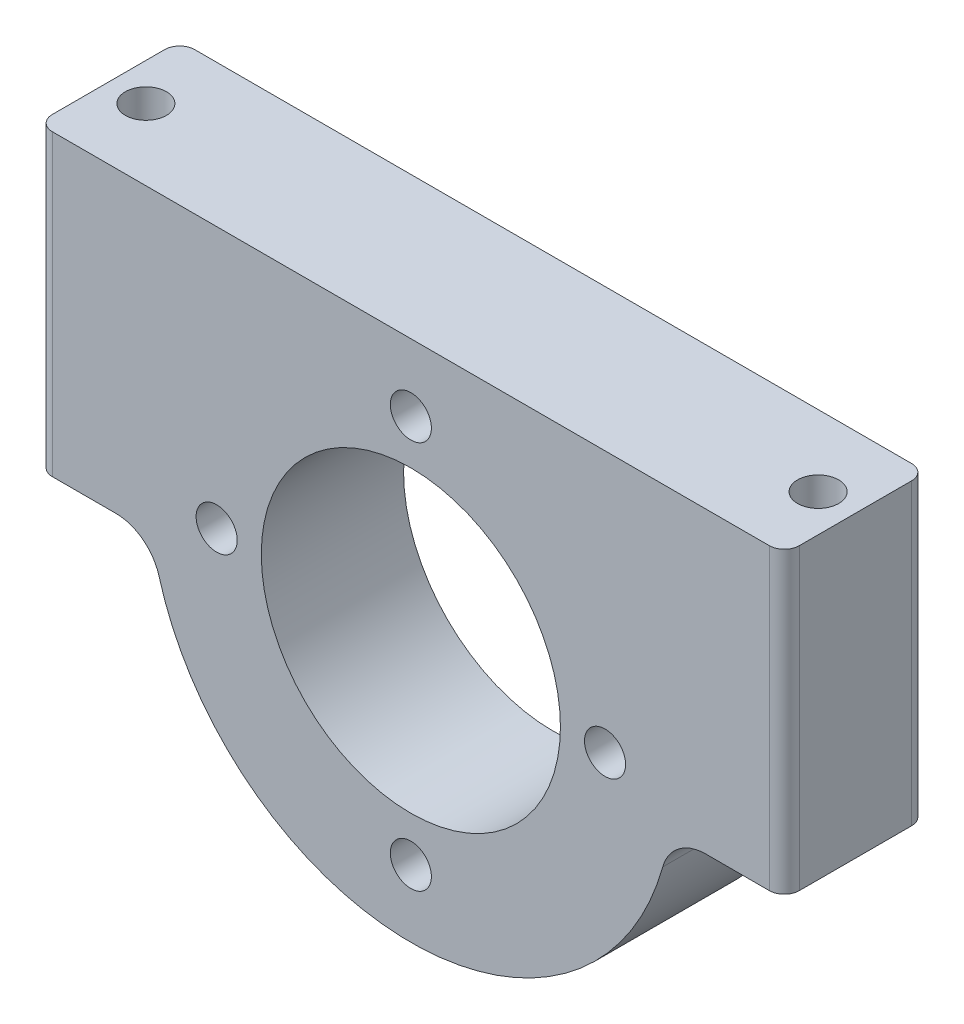
ISO-10303-21;
HEADER;
FILE_DESCRIPTION(('STEP AP214'),'2;1');
FILE_NAME('part.step','',(''),(''),'','','');
FILE_SCHEMA(('AUTOMOTIVE_DESIGN { 1 0 10303 214 1 1 1 1 }'));
ENDSEC;
DATA;
#1=APPLICATION_CONTEXT('core data for automotive mechanical design processes');
#2=APPLICATION_PROTOCOL_DEFINITION('international standard','automotive_design',2000,#1);
#3=PRODUCT_CONTEXT('',#1,'mechanical');
#4=PRODUCT('Part','Part','',(#3));
#5=PRODUCT_RELATED_PRODUCT_CATEGORY('part','',(#4));
#6=PRODUCT_DEFINITION_FORMATION('','',#4);
#7=PRODUCT_DEFINITION_CONTEXT('part definition',#1,'design');
#8=PRODUCT_DEFINITION('design','',#6,#7);
#9=PRODUCT_DEFINITION_SHAPE('','',#8);
#10=(LENGTH_UNIT() NAMED_UNIT(*) SI_UNIT(.MILLI.,.METRE.));
#11=(NAMED_UNIT(*) PLANE_ANGLE_UNIT() SI_UNIT($,.RADIAN.));
#12=(NAMED_UNIT(*) SI_UNIT($,.STERADIAN.) SOLID_ANGLE_UNIT());
#13=UNCERTAINTY_MEASURE_WITH_UNIT(LENGTH_MEASURE(1.E-05),#10,'distance_accuracy_value','');
#14=(GEOMETRIC_REPRESENTATION_CONTEXT(3) GLOBAL_UNCERTAINTY_ASSIGNED_CONTEXT((#13)) GLOBAL_UNIT_ASSIGNED_CONTEXT((#10,
#11,#12)) REPRESENTATION_CONTEXT('',''));
#15=CARTESIAN_POINT('',(0.,0.,0.));
#16=DIRECTION('',(0.,0.,1.));
#17=DIRECTION('',(1.,0.,0.));
#18=AXIS2_PLACEMENT_3D('',#15,#16,#17);
#19=CARTESIAN_POINT('',(463.810652388512,-202.071051768843,-19.05));
#20=DIRECTION('',(0.,0.,-1.));
#21=DIRECTION('',(-1.,0.,0.));
#22=AXIS2_PLACEMENT_3D('',#19,#20,#21);
#23=CYLINDRICAL_SURFACE('',#22,4.875);
#24=CARTESIAN_POINT('',(463.810652388512,-202.071051768843,-19.05));
#25=DIRECTION('',(0.,0.,-1.));
#26=DIRECTION('',(-1.,0.,0.));
#27=AXIS2_PLACEMENT_3D('',#24,#25,#26);
#28=CIRCLE('',#27,4.875);
#29=CARTESIAN_POINT('',(458.935652388512,-202.071051768843,-19.05));
#30=VERTEX_POINT('',#29);
#31=EDGE_CURVE('E147',#30,#30,#28,.F.);
#32=ORIENTED_EDGE('',*,*,#31,.F.);
#33=EDGE_LOOP('',(#32));
#34=FACE_BOUND('',#33,.T.);
#35=CARTESIAN_POINT('',(463.810652388512,-202.071051768843,-14.05));
#36=DIRECTION('',(0.,0.,-1.));
#37=DIRECTION('',(-1.,0.,0.));
#38=AXIS2_PLACEMENT_3D('',#35,#36,#37);
#39=CIRCLE('',#38,4.875);
#40=CARTESIAN_POINT('',(458.935652388512,-202.071051768843,-14.05));
#41=VERTEX_POINT('',#40);
#42=EDGE_CURVE('E239',#41,#41,#39,.T.);
#43=ORIENTED_EDGE('',*,*,#42,.F.);
#44=EDGE_LOOP('',(#43));
#45=FACE_BOUND('',#44,.T.);
#46=ADVANCED_FACE('F17',(#34,#45),#23,.F.);
#47=CARTESIAN_POINT('',(463.810652388512,-254.071051768843,-19.05));
#48=DIRECTION('',(0.,0.,-1.));
#49=DIRECTION('',(-1.,0.,0.));
#50=AXIS2_PLACEMENT_3D('',#47,#48,#49);
#51=CYLINDRICAL_SURFACE('',#50,4.875);
#52=CARTESIAN_POINT('',(463.810652388512,-254.071051768843,-19.05));
#53=DIRECTION('',(0.,0.,-1.));
#54=DIRECTION('',(-1.,0.,0.));
#55=AXIS2_PLACEMENT_3D('',#52,#53,#54);
#56=CIRCLE('',#55,4.875);
#57=CARTESIAN_POINT('',(458.935652388512,-254.071051768843,-19.05));
#58=VERTEX_POINT('',#57);
#59=EDGE_CURVE('E230',#58,#58,#56,.F.);
#60=ORIENTED_EDGE('',*,*,#59,.F.);
#61=EDGE_LOOP('',(#60));
#62=FACE_BOUND('',#61,.T.);
#63=CARTESIAN_POINT('',(463.810652388512,-254.071051768843,-14.05));
#64=DIRECTION('',(0.,0.,-1.));
#65=DIRECTION('',(-1.,0.,0.));
#66=AXIS2_PLACEMENT_3D('',#63,#64,#65);
#67=CIRCLE('',#66,4.875);
#68=CARTESIAN_POINT('',(458.935652388512,-254.071051768843,-14.05));
#69=VERTEX_POINT('',#68);
#70=EDGE_CURVE('E20',#69,#69,#67,.T.);
#71=ORIENTED_EDGE('',*,*,#70,.F.);
#72=EDGE_LOOP('',(#71));
#73=FACE_BOUND('',#72,.T.);
#74=ADVANCED_FACE('F248',(#62,#73),#51,.F.);
#75=CARTESIAN_POINT('',(489.810652388512,-228.071051768843,-19.05));
#76=DIRECTION('',(0.,0.,-1.));
#77=DIRECTION('',(-1.,0.,0.));
#78=AXIS2_PLACEMENT_3D('',#75,#76,#77);
#79=CYLINDRICAL_SURFACE('',#78,4.875);
#80=CARTESIAN_POINT('',(489.810652388512,-228.071051768843,-19.05));
#81=DIRECTION('',(0.,0.,-1.));
#82=DIRECTION('',(-1.,0.,0.));
#83=AXIS2_PLACEMENT_3D('',#80,#81,#82);
#84=CIRCLE('',#83,4.875);
#85=CARTESIAN_POINT('',(484.935652388512,-228.071051768843,-19.05));
#86=VERTEX_POINT('',#85);
#87=EDGE_CURVE('E227',#86,#86,#84,.F.);
#88=ORIENTED_EDGE('',*,*,#87,.F.);
#89=EDGE_LOOP('',(#88));
#90=FACE_BOUND('',#89,.T.);
#91=CARTESIAN_POINT('',(489.810652388512,-228.071051768843,-14.05));
#92=DIRECTION('',(0.,0.,-1.));
#93=DIRECTION('',(-1.,0.,0.));
#94=AXIS2_PLACEMENT_3D('',#91,#92,#93);
#95=CIRCLE('',#94,4.875);
#96=CARTESIAN_POINT('',(484.935652388512,-228.071051768843,-14.05));
#97=VERTEX_POINT('',#96);
#98=EDGE_CURVE('E148',#97,#97,#95,.T.);
#99=ORIENTED_EDGE('',*,*,#98,.F.);
#100=EDGE_LOOP('',(#99));
#101=FACE_BOUND('',#100,.T.);
#102=ADVANCED_FACE('F250',(#90,#101),#79,.F.);
#103=CARTESIAN_POINT('',(437.810652388512,-228.071051768843,-19.05));
#104=DIRECTION('',(0.,0.,-1.));
#105=DIRECTION('',(-1.,0.,0.));
#106=AXIS2_PLACEMENT_3D('',#103,#104,#105);
#107=CYLINDRICAL_SURFACE('',#106,4.875);
#108=CARTESIAN_POINT('',(437.810652388512,-228.071051768843,-19.05));
#109=DIRECTION('',(0.,0.,-1.));
#110=DIRECTION('',(-1.,0.,0.));
#111=AXIS2_PLACEMENT_3D('',#108,#109,#110);
#112=CIRCLE('',#111,4.875);
#113=CARTESIAN_POINT('',(432.935652388512,-228.071051768843,-19.05));
#114=VERTEX_POINT('',#113);
#115=EDGE_CURVE('E122',#114,#114,#112,.F.);
#116=ORIENTED_EDGE('',*,*,#115,.F.);
#117=EDGE_LOOP('',(#116));
#118=FACE_BOUND('',#117,.T.);
#119=CARTESIAN_POINT('',(437.810652388512,-228.071051768843,-14.05));
#120=DIRECTION('',(0.,0.,-1.));
#121=DIRECTION('',(-1.,0.,0.));
#122=AXIS2_PLACEMENT_3D('',#119,#120,#121);
#123=CIRCLE('',#122,4.875);
#124=CARTESIAN_POINT('',(432.935652388512,-228.071051768843,-14.05));
#125=VERTEX_POINT('',#124);
#126=EDGE_CURVE('E237',#125,#125,#123,.T.);
#127=ORIENTED_EDGE('',*,*,#126,.F.);
#128=EDGE_LOOP('',(#127));
#129=FACE_BOUND('',#128,.T.);
#130=ADVANCED_FACE('F257',(#118,#129),#107,.F.);
#131=CARTESIAN_POINT('',(463.810652388512,-195.508551768842,-14.05));
#132=DIRECTION('',(0.,0.,-1.));
#133=DIRECTION('',(-1.,0.,0.));
#134=AXIS2_PLACEMENT_3D('',#131,#132,#133);
#135=PLANE('',#134);
#136=CARTESIAN_POINT('',(463.810652388512,-254.071051768843,-14.05));
#137=DIRECTION('',(0.,0.,-1.));
#138=DIRECTION('',(-1.,0.,0.));
#139=AXIS2_PLACEMENT_3D('',#136,#137,#138);
#140=CIRCLE('',#139,2.75);
#141=CARTESIAN_POINT('',(461.060652388512,-254.071051768843,-14.05));
#142=VERTEX_POINT('',#141);
#143=EDGE_CURVE('E143',#142,#142,#140,.F.);
#144=ORIENTED_EDGE('',*,*,#143,.T.);
#145=EDGE_LOOP('',(#144));
#146=FACE_BOUND('',#145,.T.);
#147=ORIENTED_EDGE('',*,*,#70,.T.);
#148=EDGE_LOOP('',(#147));
#149=FACE_BOUND('',#148,.T.);
#150=ADVANCED_FACE('F246',(#146,#149),#135,.T.);
#151=CARTESIAN_POINT('',(463.810652388512,-195.508551768842,-14.05));
#152=DIRECTION('',(0.,0.,-1.));
#153=DIRECTION('',(-1.,0.,0.));
#154=AXIS2_PLACEMENT_3D('',#151,#152,#153);
#155=PLANE('',#154);
#156=CARTESIAN_POINT('',(463.810652388512,-202.071051768843,-14.05));
#157=DIRECTION('',(0.,0.,-1.));
#158=DIRECTION('',(-1.,0.,0.));
#159=AXIS2_PLACEMENT_3D('',#156,#157,#158);
#160=CIRCLE('',#159,2.75);
#161=CARTESIAN_POINT('',(461.060652388512,-202.071051768843,-14.05));
#162=VERTEX_POINT('',#161);
#163=EDGE_CURVE('E220',#162,#162,#160,.F.);
#164=ORIENTED_EDGE('',*,*,#163,.T.);
#165=EDGE_LOOP('',(#164));
#166=FACE_BOUND('',#165,.T.);
#167=ORIENTED_EDGE('',*,*,#42,.T.);
#168=EDGE_LOOP('',(#167));
#169=FACE_BOUND('',#168,.T.);
#170=ADVANCED_FACE('F350',(#166,#169),#155,.T.);
#171=CARTESIAN_POINT('',(463.810652388512,-195.508551768842,-14.05));
#172=DIRECTION('',(0.,0.,-1.));
#173=DIRECTION('',(-1.,0.,0.));
#174=AXIS2_PLACEMENT_3D('',#171,#172,#173);
#175=PLANE('',#174);
#176=CARTESIAN_POINT('',(437.810652388512,-228.071051768843,-14.05));
#177=DIRECTION('',(0.,0.,-1.));
#178=DIRECTION('',(-1.,0.,0.));
#179=AXIS2_PLACEMENT_3D('',#176,#177,#178);
#180=CIRCLE('',#179,2.75);
#181=CARTESIAN_POINT('',(435.060652388512,-228.071051768843,-14.05));
#182=VERTEX_POINT('',#181);
#183=EDGE_CURVE('E214',#182,#182,#180,.F.);
#184=ORIENTED_EDGE('',*,*,#183,.T.);
#185=EDGE_LOOP('',(#184));
#186=FACE_BOUND('',#185,.T.);
#187=ORIENTED_EDGE('',*,*,#126,.T.);
#188=EDGE_LOOP('',(#187));
#189=FACE_BOUND('',#188,.T.);
#190=ADVANCED_FACE('F346',(#186,#189),#175,.T.);
#191=CARTESIAN_POINT('',(463.810652388512,-195.508551768842,-14.05));
#192=DIRECTION('',(0.,0.,-1.));
#193=DIRECTION('',(-1.,0.,0.));
#194=AXIS2_PLACEMENT_3D('',#191,#192,#193);
#195=PLANE('',#194);
#196=CARTESIAN_POINT('',(489.810652388512,-228.071051768843,-14.05));
#197=DIRECTION('',(0.,0.,-1.));
#198=DIRECTION('',(-1.,0.,0.));
#199=AXIS2_PLACEMENT_3D('',#196,#197,#198);
#200=CIRCLE('',#199,2.75);
#201=CARTESIAN_POINT('',(487.060652388512,-228.071051768843,-14.05));
#202=VERTEX_POINT('',#201);
#203=EDGE_CURVE('E211',#202,#202,#200,.F.);
#204=ORIENTED_EDGE('',*,*,#203,.T.);
#205=EDGE_LOOP('',(#204));
#206=FACE_BOUND('',#205,.T.);
#207=ORIENTED_EDGE('',*,*,#98,.T.);
#208=EDGE_LOOP('',(#207));
#209=FACE_BOUND('',#208,.T.);
#210=ADVANCED_FACE('F342',(#206,#209),#195,.T.);
#211=CARTESIAN_POINT('',(508.810652388512,-186.071049368843,-9.52500000000001));
#212=DIRECTION('',(0.,-1.,0.));
#213=DIRECTION('',(0.,0.,-1.));
#214=AXIS2_PLACEMENT_3D('',#211,#212,#213);
#215=CYLINDRICAL_SURFACE('',#214,2.75);
#216=CARTESIAN_POINT('',(508.810652388512,-233.071051768843,-9.52500000000001));
#217=DIRECTION('',(0.,-1.,0.));
#218=DIRECTION('',(0.,0.,-1.));
#219=AXIS2_PLACEMENT_3D('',#216,#217,#218);
#220=CIRCLE('',#219,2.75);
#221=CARTESIAN_POINT('',(508.810652388512,-233.071051768843,-12.275));
#222=VERTEX_POINT('',#221);
#223=EDGE_CURVE('E202',#222,#222,#220,.F.);
#224=ORIENTED_EDGE('',*,*,#223,.F.);
#225=EDGE_LOOP('',(#224));
#226=FACE_BOUND('',#225,.T.);
#227=CARTESIAN_POINT('',(508.810652388512,-193.071051768843,-9.52500000000001));
#228=DIRECTION('',(0.,-1.,0.));
#229=DIRECTION('',(0.,0.,-1.));
#230=AXIS2_PLACEMENT_3D('',#227,#228,#229);
#231=CIRCLE('',#230,2.75);
#232=CARTESIAN_POINT('',(508.810652388512,-193.071051768843,-12.275));
#233=VERTEX_POINT('',#232);
#234=EDGE_CURVE('E208',#233,#233,#231,.T.);
#235=ORIENTED_EDGE('',*,*,#234,.F.);
#236=EDGE_LOOP('',(#235));
#237=FACE_BOUND('',#236,.T.);
#238=ADVANCED_FACE('F339',(#226,#237),#215,.F.);
#239=CARTESIAN_POINT('',(511.810652388512,0.78094512195122,-17.05));
#240=DIRECTION('',(0.,-1.,0.));
#241=DIRECTION('',(0.,0.,-1.));
#242=AXIS2_PLACEMENT_3D('',#239,#240,#241);
#243=CYLINDRICAL_SURFACE('',#242,2.);
#244=DIRECTION('',(0.,1.,0.));
#245=VECTOR('',#244,1.);
#246=CARTESIAN_POINT('',(513.810652388512,-263.071051768843,-17.05));
#247=LINE('',#246,#245);
#248=CARTESIAN_POINT('',(513.810652388512,-233.071051768843,-17.05));
#249=VERTEX_POINT('',#248);
#250=CARTESIAN_POINT('',(513.810652388512,-193.071051768843,-17.05));
#251=VERTEX_POINT('',#250);
#252=EDGE_CURVE('E97',#249,#251,#247,.T.);
#253=ORIENTED_EDGE('',*,*,#252,.F.);
#254=CARTESIAN_POINT('',(511.810652388512,-233.071051768843,-17.05));
#255=DIRECTION('',(0.,-1.,0.));
#256=DIRECTION('',(0.,0.,-1.));
#257=AXIS2_PLACEMENT_3D('',#254,#255,#256);
#258=CIRCLE('',#257,2.);
#259=CARTESIAN_POINT('',(511.810652388512,-233.071051768843,-19.05));
#260=VERTEX_POINT('',#259);
#261=EDGE_CURVE('E117',#260,#249,#258,.T.);
#262=ORIENTED_EDGE('',*,*,#261,.F.);
#263=DIRECTION('',(0.,1.,0.));
#264=VECTOR('',#263,1.);
#265=CARTESIAN_POINT('',(511.810652388512,0.78094512195122,-19.05));
#266=LINE('',#265,#264);
#267=CARTESIAN_POINT('',(511.810652388512,-193.071051768843,-19.05));
#268=VERTEX_POINT('',#267);
#269=EDGE_CURVE('E115',#268,#260,#266,.F.);
#270=ORIENTED_EDGE('',*,*,#269,.F.);
#271=CARTESIAN_POINT('',(511.810652388512,-193.071051768843,-17.05));
#272=DIRECTION('',(0.,-1.,0.));
#273=DIRECTION('',(0.,0.,-1.));
#274=AXIS2_PLACEMENT_3D('',#271,#272,#273);
#275=CIRCLE('',#274,2.);
#276=EDGE_CURVE('E103',#251,#268,#275,.F.);
#277=ORIENTED_EDGE('',*,*,#276,.F.);
#278=EDGE_LOOP('',(#253,#262,#270,#277));
#279=FACE_BOUND('',#278,.T.);
#280=ADVANCED_FACE('F116',(#279),#243,.T.);
#281=CARTESIAN_POINT('',(513.810652388512,-263.071051768843,0.));
#282=DIRECTION('',(1.,0.,0.));
#283=DIRECTION('',(0.,0.,-1.));
#284=AXIS2_PLACEMENT_3D('',#281,#282,#283);
#285=PLANE('',#284);
#286=ORIENTED_EDGE('',*,*,#252,.T.);
#287=DIRECTION('',(0.,0.,1.));
#288=VECTOR('',#287,1.);
#289=CARTESIAN_POINT('',(513.810652388512,-193.071051768843,0.));
#290=LINE('',#289,#288);
#291=CARTESIAN_POINT('',(513.810652388512,-193.071051768843,-2.));
#292=VERTEX_POINT('',#291);
#293=EDGE_CURVE('E111',#292,#251,#290,.F.);
#294=ORIENTED_EDGE('',*,*,#293,.F.);
#295=DIRECTION('',(0.,-1.,0.));
#296=VECTOR('',#295,1.);
#297=CARTESIAN_POINT('',(513.810652388512,0.78094512195122,-2.));
#298=LINE('',#297,#296);
#299=CARTESIAN_POINT('',(513.810652388512,-233.071051768843,-2.));
#300=VERTEX_POINT('',#299);
#301=EDGE_CURVE('E144',#300,#292,#298,.F.);
#302=ORIENTED_EDGE('',*,*,#301,.F.);
#303=DIRECTION('',(0.,0.,-1.));
#304=VECTOR('',#303,1.);
#305=CARTESIAN_POINT('',(513.810652388512,-233.071051768843,-9.52499999999998));
#306=LINE('',#305,#304);
#307=EDGE_CURVE('E199',#249,#300,#306,.F.);
#308=ORIENTED_EDGE('',*,*,#307,.F.);
#309=EDGE_LOOP('',(#286,#294,#302,#308));
#310=FACE_BOUND('',#309,.T.);
#311=ADVANCED_FACE('F333',(#310),#285,.T.);
#312=CARTESIAN_POINT('',(418.810652388512,-186.071049368843,-9.52500000000001));
#313=DIRECTION('',(0.,-1.,0.));
#314=DIRECTION('',(0.,0.,-1.));
#315=AXIS2_PLACEMENT_3D('',#312,#313,#314);
#316=CYLINDRICAL_SURFACE('',#315,2.75);
#317=CARTESIAN_POINT('',(418.810652388512,-233.071051768843,-9.52500000000001));
#318=DIRECTION('',(0.,-1.,0.));
#319=DIRECTION('',(0.,0.,-1.));
#320=AXIS2_PLACEMENT_3D('',#317,#318,#319);
#321=CIRCLE('',#320,2.75);
#322=CARTESIAN_POINT('',(418.810652388512,-233.071051768843,-12.275));
#323=VERTEX_POINT('',#322);
#324=EDGE_CURVE('E183',#323,#323,#321,.F.);
#325=ORIENTED_EDGE('',*,*,#324,.F.);
#326=EDGE_LOOP('',(#325));
#327=FACE_BOUND('',#326,.T.);
#328=CARTESIAN_POINT('',(418.810652388512,-193.071051768843,-9.52500000000001));
#329=DIRECTION('',(0.,-1.,0.));
#330=DIRECTION('',(0.,0.,-1.));
#331=AXIS2_PLACEMENT_3D('',#328,#329,#330);
#332=CIRCLE('',#331,2.75);
#333=CARTESIAN_POINT('',(418.810652388512,-193.071051768843,-12.275));
#334=VERTEX_POINT('',#333);
#335=EDGE_CURVE('E136',#334,#334,#332,.T.);
#336=ORIENTED_EDGE('',*,*,#335,.F.);
#337=EDGE_LOOP('',(#336));
#338=FACE_BOUND('',#337,.T.);
#339=ADVANCED_FACE('F329',(#327,#338),#316,.F.);
#340=CARTESIAN_POINT('',(415.810652388512,0.78094512195122,-17.05));
#341=DIRECTION('',(0.,1.,0.));
#342=DIRECTION('',(0.,0.,1.));
#343=AXIS2_PLACEMENT_3D('',#340,#341,#342);
#344=CYLINDRICAL_SURFACE('',#343,2.);
#345=DIRECTION('',(0.,1.,0.));
#346=VECTOR('',#345,1.);
#347=CARTESIAN_POINT('',(413.810652388512,-193.071051768843,-17.05));
#348=LINE('',#347,#346);
#349=CARTESIAN_POINT('',(413.810652388512,-193.071051768843,-17.05));
#350=VERTEX_POINT('',#349);
#351=CARTESIAN_POINT('',(413.810652388512,-233.071051768843,-17.05));
#352=VERTEX_POINT('',#351);
#353=EDGE_CURVE('E141',#350,#352,#348,.F.);
#354=ORIENTED_EDGE('',*,*,#353,.F.);
#355=CARTESIAN_POINT('',(415.810652388512,-193.071051768843,-17.05));
#356=DIRECTION('',(0.,1.,0.));
#357=DIRECTION('',(0.,0.,1.));
#358=AXIS2_PLACEMENT_3D('',#355,#356,#357);
#359=CIRCLE('',#358,2.);
#360=CARTESIAN_POINT('',(415.810652388512,-193.071051768843,-19.05));
#361=VERTEX_POINT('',#360);
#362=EDGE_CURVE('E128',#361,#350,#359,.T.);
#363=ORIENTED_EDGE('',*,*,#362,.F.);
#364=DIRECTION('',(0.,1.,0.));
#365=VECTOR('',#364,1.);
#366=CARTESIAN_POINT('',(415.810652388512,0.78094512195122,-19.05));
#367=LINE('',#366,#365);
#368=CARTESIAN_POINT('',(415.810652388512,-233.071051768843,-19.05));
#369=VERTEX_POINT('',#368);
#370=EDGE_CURVE('E121',#369,#361,#367,.T.);
#371=ORIENTED_EDGE('',*,*,#370,.F.);
#372=CARTESIAN_POINT('',(415.810652388512,-233.071051768843,-17.05));
#373=DIRECTION('',(0.,1.,0.));
#374=DIRECTION('',(0.,0.,1.));
#375=AXIS2_PLACEMENT_3D('',#372,#373,#374);
#376=CIRCLE('',#375,2.);
#377=EDGE_CURVE('E180',#352,#369,#376,.F.);
#378=ORIENTED_EDGE('',*,*,#377,.F.);
#379=EDGE_LOOP('',(#354,#363,#371,#378));
#380=FACE_BOUND('',#379,.T.);
#381=ADVANCED_FACE('F326',(#380),#344,.T.);
#382=CARTESIAN_POINT('',(5.,0.78094512195122,-19.05));
#383=DIRECTION('',(0.,0.,-1.));
#384=DIRECTION('',(-1.,0.,0.));
#385=AXIS2_PLACEMENT_3D('',#382,#383,#384);
#386=PLANE('',#385);
#387=ORIENTED_EDGE('',*,*,#370,.T.);
#388=DIRECTION('',(1.,0.,0.));
#389=VECTOR('',#388,1.);
#390=CARTESIAN_POINT('',(513.810652388512,-193.071051768843,-19.05));
#391=LINE('',#390,#389);
#392=EDGE_CURVE('E108',#268,#361,#391,.F.);
#393=ORIENTED_EDGE('',*,*,#392,.F.);
#394=ORIENTED_EDGE('',*,*,#269,.T.);
#395=DIRECTION('',(1.,0.,0.));
#396=VECTOR('',#395,1.);
#397=CARTESIAN_POINT('',(463.810652388512,-233.071051768843,-19.05));
#398=LINE('',#397,#396);
#399=CARTESIAN_POINT('',(503.307487704775,-233.071051768843,-19.05));
#400=VERTEX_POINT('',#399);
#401=EDGE_CURVE('E201',#400,#260,#398,.T.);
#402=ORIENTED_EDGE('',*,*,#401,.F.);
#403=CARTESIAN_POINT('',(503.307487704775,-239.071051768843,-19.05));
#404=DIRECTION('',(0.,0.,-1.));
#405=DIRECTION('',(-1.,0.,0.));
#406=AXIS2_PLACEMENT_3D('',#403,#404,#405);
#407=CIRCLE('',#406,6.);
#408=CARTESIAN_POINT('',(497.527463024346,-237.461295671282,-19.05));
#409=VERTEX_POINT('',#408);
#410=EDGE_CURVE('E194',#400,#409,#407,.F.);
#411=ORIENTED_EDGE('',*,*,#410,.T.);
#412=CARTESIAN_POINT('',(463.810652388512,-228.071051768843,-19.05));
#413=DIRECTION('',(0.,0.,-1.));
#414=DIRECTION('',(-1.,0.,0.));
#415=AXIS2_PLACEMENT_3D('',#412,#413,#414);
#416=CIRCLE('',#415,35.);
#417=CARTESIAN_POINT('',(430.093841752678,-237.461295671282,-19.05));
#418=VERTEX_POINT('',#417);
#419=EDGE_CURVE('E190',#418,#409,#416,.F.);
#420=ORIENTED_EDGE('',*,*,#419,.F.);
#421=CARTESIAN_POINT('',(424.313817072249,-239.071051768843,-19.05));
#422=DIRECTION('',(0.,0.,-1.));
#423=DIRECTION('',(-1.,0.,0.));
#424=AXIS2_PLACEMENT_3D('',#421,#422,#423);
#425=CIRCLE('',#424,6.);
#426=CARTESIAN_POINT('',(424.313817072249,-233.071051768843,-19.05));
#427=VERTEX_POINT('',#426);
#428=EDGE_CURVE('E187',#418,#427,#425,.F.);
#429=ORIENTED_EDGE('',*,*,#428,.T.);
#430=DIRECTION('',(1.,0.,0.));
#431=VECTOR('',#430,1.);
#432=CARTESIAN_POINT('',(463.810652388512,-233.071051768843,-19.05));
#433=LINE('',#432,#431);
#434=EDGE_CURVE('E179',#369,#427,#433,.T.);
#435=ORIENTED_EDGE('',*,*,#434,.F.);
#436=EDGE_LOOP('',(#387,#393,#394,#402,#411,#420,#429,#435));
#437=FACE_BOUND('',#436,.T.);
#438=ORIENTED_EDGE('',*,*,#115,.T.);
#439=EDGE_LOOP('',(#438));
#440=FACE_BOUND('',#439,.T.);
#441=ORIENTED_EDGE('',*,*,#87,.T.);
#442=EDGE_LOOP('',(#441));
#443=FACE_BOUND('',#442,.T.);
#444=CARTESIAN_POINT('',(463.810652388512,-228.071051768843,-19.05));
#445=DIRECTION('',(0.,0.,-1.));
#446=DIRECTION('',(-1.,0.,0.));
#447=AXIS2_PLACEMENT_3D('',#444,#445,#446);
#448=CIRCLE('',#447,20.025);
#449=CARTESIAN_POINT('',(443.785652388512,-228.071051768843,-19.05));
#450=VERTEX_POINT('',#449);
#451=EDGE_CURVE('E217',#450,#450,#448,.F.);
#452=ORIENTED_EDGE('',*,*,#451,.T.);
#453=EDGE_LOOP('',(#452));
#454=FACE_BOUND('',#453,.T.);
#455=ORIENTED_EDGE('',*,*,#59,.T.);
#456=EDGE_LOOP('',(#455));
#457=FACE_BOUND('',#456,.T.);
#458=ORIENTED_EDGE('',*,*,#31,.T.);
#459=EDGE_LOOP('',(#458));
#460=FACE_BOUND('',#459,.T.);
#461=ADVANCED_FACE('F124',(#437,#440,#443,#454,#457,#460),#386,.T.);
#462=CARTESIAN_POINT('',(413.810652388512,-193.071051768843,0.));
#463=DIRECTION('',(-1.,0.,0.));
#464=DIRECTION('',(0.,0.,1.));
#465=AXIS2_PLACEMENT_3D('',#462,#463,#464);
#466=PLANE('',#465);
#467=DIRECTION('',(0.,0.,1.));
#468=VECTOR('',#467,1.);
#469=CARTESIAN_POINT('',(413.810652388512,-193.071051768843,0.));
#470=LINE('',#469,#468);
#471=CARTESIAN_POINT('',(413.810652388512,-193.071051768843,-2.));
#472=VERTEX_POINT('',#471);
#473=EDGE_CURVE('E130',#350,#472,#470,.T.);
#474=ORIENTED_EDGE('',*,*,#473,.F.);
#475=ORIENTED_EDGE('',*,*,#353,.T.);
#476=DIRECTION('',(0.,0.,-1.));
#477=VECTOR('',#476,1.);
#478=CARTESIAN_POINT('',(413.810652388512,-233.071051768843,-9.52499999999998));
#479=LINE('',#478,#477);
#480=CARTESIAN_POINT('',(413.810652388512,-233.071051768843,-2.));
#481=VERTEX_POINT('',#480);
#482=EDGE_CURVE('E182',#481,#352,#479,.T.);
#483=ORIENTED_EDGE('',*,*,#482,.F.);
#484=DIRECTION('',(0.,1.,0.));
#485=VECTOR('',#484,1.);
#486=CARTESIAN_POINT('',(413.810652388512,0.78094512195122,-2.));
#487=LINE('',#486,#485);
#488=EDGE_CURVE('E137',#472,#481,#487,.F.);
#489=ORIENTED_EDGE('',*,*,#488,.F.);
#490=EDGE_LOOP('',(#474,#475,#483,#489));
#491=FACE_BOUND('',#490,.T.);
#492=ADVANCED_FACE('F319',(#491),#466,.T.);
#493=CARTESIAN_POINT('',(463.810652388512,-254.071051768843,1.90500239999994));
#494=DIRECTION('',(0.,0.,-1.));
#495=DIRECTION('',(-1.,0.,0.));
#496=AXIS2_PLACEMENT_3D('',#493,#494,#495);
#497=CYLINDRICAL_SURFACE('',#496,2.75);
#498=ORIENTED_EDGE('',*,*,#143,.F.);
#499=EDGE_LOOP('',(#498));
#500=FACE_BOUND('',#499,.T.);
#501=CARTESIAN_POINT('',(463.810652388512,-254.071051768843,0.));
#502=DIRECTION('',(0.,0.,-1.));
#503=DIRECTION('',(-1.,0.,0.));
#504=AXIS2_PLACEMENT_3D('',#501,#502,#503);
#505=CIRCLE('',#504,2.75);
#506=CARTESIAN_POINT('',(461.060652388512,-254.071051768843,0.));
#507=VERTEX_POINT('',#506);
#508=EDGE_CURVE('E173',#507,#507,#505,.F.);
#509=ORIENTED_EDGE('',*,*,#508,.T.);
#510=EDGE_LOOP('',(#509));
#511=FACE_BOUND('',#510,.T.);
#512=ADVANCED_FACE('F315',(#500,#511),#497,.F.);
#513=CARTESIAN_POINT('',(463.810652388512,-202.071051768843,1.90500239999994));
#514=DIRECTION('',(0.,0.,-1.));
#515=DIRECTION('',(-1.,0.,0.));
#516=AXIS2_PLACEMENT_3D('',#513,#514,#515);
#517=CYLINDRICAL_SURFACE('',#516,2.75);
#518=ORIENTED_EDGE('',*,*,#163,.F.);
#519=EDGE_LOOP('',(#518));
#520=FACE_BOUND('',#519,.T.);
#521=CARTESIAN_POINT('',(463.810652388512,-202.071051768843,0.));
#522=DIRECTION('',(0.,0.,-1.));
#523=DIRECTION('',(-1.,0.,0.));
#524=AXIS2_PLACEMENT_3D('',#521,#522,#523);
#525=CIRCLE('',#524,2.75);
#526=CARTESIAN_POINT('',(461.060652388512,-202.071051768843,0.));
#527=VERTEX_POINT('',#526);
#528=EDGE_CURVE('E170',#527,#527,#525,.F.);
#529=ORIENTED_EDGE('',*,*,#528,.T.);
#530=EDGE_LOOP('',(#529));
#531=FACE_BOUND('',#530,.T.);
#532=ADVANCED_FACE('F311',(#520,#531),#517,.F.);
#533=CARTESIAN_POINT('',(463.810652388512,-228.071051768843,0.));
#534=DIRECTION('',(0.,0.,-1.));
#535=DIRECTION('',(-1.,0.,0.));
#536=AXIS2_PLACEMENT_3D('',#533,#534,#535);
#537=CYLINDRICAL_SURFACE('',#536,20.025);
#538=CARTESIAN_POINT('',(463.810652388512,-228.071051768843,0.));
#539=DIRECTION('',(0.,0.,-1.));
#540=DIRECTION('',(-1.,0.,0.));
#541=AXIS2_PLACEMENT_3D('',#538,#539,#540);
#542=CIRCLE('',#541,20.025);
#543=CARTESIAN_POINT('',(443.785652388512,-228.071051768843,0.));
#544=VERTEX_POINT('',#543);
#545=EDGE_CURVE('E167',#544,#544,#542,.F.);
#546=ORIENTED_EDGE('',*,*,#545,.T.);
#547=EDGE_LOOP('',(#546));
#548=FACE_BOUND('',#547,.T.);
#549=ORIENTED_EDGE('',*,*,#451,.F.);
#550=EDGE_LOOP('',(#549));
#551=FACE_BOUND('',#550,.T.);
#552=ADVANCED_FACE('F307',(#548,#551),#537,.F.);
#553=CARTESIAN_POINT('',(437.810652388512,-228.071051768843,1.90500239999994));
#554=DIRECTION('',(0.,0.,-1.));
#555=DIRECTION('',(-1.,0.,0.));
#556=AXIS2_PLACEMENT_3D('',#553,#554,#555);
#557=CYLINDRICAL_SURFACE('',#556,2.75);
#558=ORIENTED_EDGE('',*,*,#183,.F.);
#559=EDGE_LOOP('',(#558));
#560=FACE_BOUND('',#559,.T.);
#561=CARTESIAN_POINT('',(437.810652388512,-228.071051768843,0.));
#562=DIRECTION('',(0.,0.,-1.));
#563=DIRECTION('',(-1.,0.,0.));
#564=AXIS2_PLACEMENT_3D('',#561,#562,#563);
#565=CIRCLE('',#564,2.75);
#566=CARTESIAN_POINT('',(435.060652388512,-228.071051768843,0.));
#567=VERTEX_POINT('',#566);
#568=EDGE_CURVE('E164',#567,#567,#565,.F.);
#569=ORIENTED_EDGE('',*,*,#568,.T.);
#570=EDGE_LOOP('',(#569));
#571=FACE_BOUND('',#570,.T.);
#572=ADVANCED_FACE('F303',(#560,#571),#557,.F.);
#573=CARTESIAN_POINT('',(489.810652388512,-228.071051768843,1.90500239999994));
#574=DIRECTION('',(0.,0.,-1.));
#575=DIRECTION('',(-1.,0.,0.));
#576=AXIS2_PLACEMENT_3D('',#573,#574,#575);
#577=CYLINDRICAL_SURFACE('',#576,2.75);
#578=ORIENTED_EDGE('',*,*,#203,.F.);
#579=EDGE_LOOP('',(#578));
#580=FACE_BOUND('',#579,.T.);
#581=CARTESIAN_POINT('',(489.810652388512,-228.071051768843,0.));
#582=DIRECTION('',(0.,0.,-1.));
#583=DIRECTION('',(-1.,0.,0.));
#584=AXIS2_PLACEMENT_3D('',#581,#582,#583);
#585=CIRCLE('',#584,2.75);
#586=CARTESIAN_POINT('',(487.060652388512,-228.071051768843,0.));
#587=VERTEX_POINT('',#586);
#588=EDGE_CURVE('E160',#587,#587,#585,.F.);
#589=ORIENTED_EDGE('',*,*,#588,.T.);
#590=EDGE_LOOP('',(#589));
#591=FACE_BOUND('',#590,.T.);
#592=ADVANCED_FACE('F300',(#580,#591),#577,.F.);
#593=CARTESIAN_POINT('',(513.810652388512,-193.071051768843,0.));
#594=DIRECTION('',(0.,1.,0.));
#595=DIRECTION('',(0.,0.,1.));
#596=AXIS2_PLACEMENT_3D('',#593,#594,#595);
#597=PLANE('',#596);
#598=ORIENTED_EDGE('',*,*,#473,.T.);
#599=CARTESIAN_POINT('',(415.810652388512,-193.071051768843,-2.));
#600=DIRECTION('',(0.,1.,0.));
#601=DIRECTION('',(0.,0.,1.));
#602=AXIS2_PLACEMENT_3D('',#599,#600,#601);
#603=CIRCLE('',#602,2.);
#604=CARTESIAN_POINT('',(415.810652388512,-193.071051768843,0.));
#605=VERTEX_POINT('',#604);
#606=EDGE_CURVE('E139',#605,#472,#603,.F.);
#607=ORIENTED_EDGE('',*,*,#606,.F.);
#608=DIRECTION('',(-1.,0.,0.));
#609=VECTOR('',#608,1.);
#610=CARTESIAN_POINT('',(5.,-193.071051768843,0.));
#611=LINE('',#610,#609);
#612=CARTESIAN_POINT('',(511.810652388512,-193.071051768843,0.));
#613=VERTEX_POINT('',#612);
#614=EDGE_CURVE('E163',#605,#613,#611,.F.);
#615=ORIENTED_EDGE('',*,*,#614,.T.);
#616=CARTESIAN_POINT('',(511.810652388512,-193.071051768843,-2.));
#617=DIRECTION('',(0.,-1.,0.));
#618=DIRECTION('',(0.,0.,-1.));
#619=AXIS2_PLACEMENT_3D('',#616,#617,#618);
#620=CIRCLE('',#619,2.);
#621=EDGE_CURVE('E146',#292,#613,#620,.T.);
#622=ORIENTED_EDGE('',*,*,#621,.F.);
#623=ORIENTED_EDGE('',*,*,#293,.T.);
#624=ORIENTED_EDGE('',*,*,#276,.T.);
#625=ORIENTED_EDGE('',*,*,#392,.T.);
#626=ORIENTED_EDGE('',*,*,#362,.T.);
#627=EDGE_LOOP('',(#598,#607,#615,#622,#623,#624,#625,#626));
#628=FACE_BOUND('',#627,.T.);
#629=ORIENTED_EDGE('',*,*,#335,.T.);
#630=EDGE_LOOP('',(#629));
#631=FACE_BOUND('',#630,.T.);
#632=ORIENTED_EDGE('',*,*,#234,.T.);
#633=EDGE_LOOP('',(#632));
#634=FACE_BOUND('',#633,.T.);
#635=ADVANCED_FACE('F105',(#628,#631,#634),#597,.T.);
#636=CARTESIAN_POINT('',(511.810652388512,0.78094512195122,-2.));
#637=DIRECTION('',(0.,-1.,0.));
#638=DIRECTION('',(0.,0.,-1.));
#639=AXIS2_PLACEMENT_3D('',#636,#637,#638);
#640=CYLINDRICAL_SURFACE('',#639,2.);
#641=ORIENTED_EDGE('',*,*,#301,.T.);
#642=ORIENTED_EDGE('',*,*,#621,.T.);
#643=DIRECTION('',(0.,1.,0.));
#644=VECTOR('',#643,1.);
#645=CARTESIAN_POINT('',(511.810652388512,0.78094512195122,0.));
#646=LINE('',#645,#644);
#647=CARTESIAN_POINT('',(511.810652388512,-233.071051768843,0.));
#648=VERTEX_POINT('',#647);
#649=EDGE_CURVE('E625',#613,#648,#646,.F.);
#650=ORIENTED_EDGE('',*,*,#649,.T.);
#651=CARTESIAN_POINT('',(511.810652388512,-233.071051768843,-2.));
#652=DIRECTION('',(0.,-1.,0.));
#653=DIRECTION('',(0.,0.,-1.));
#654=AXIS2_PLACEMENT_3D('',#651,#652,#653);
#655=CIRCLE('',#654,2.);
#656=EDGE_CURVE('E197',#300,#648,#655,.T.);
#657=ORIENTED_EDGE('',*,*,#656,.F.);
#658=EDGE_LOOP('',(#641,#642,#650,#657));
#659=FACE_BOUND('',#658,.T.);
#660=ADVANCED_FACE('F293',(#659),#640,.T.);
#661=CARTESIAN_POINT('',(463.810652388512,-233.071051768843,-9.52499999999998));
#662=DIRECTION('',(0.,-1.,0.));
#663=DIRECTION('',(0.,0.,-1.));
#664=AXIS2_PLACEMENT_3D('',#661,#662,#663);
#665=PLANE('',#664);
#666=ORIENTED_EDGE('',*,*,#656,.T.);
#667=DIRECTION('',(-1.,0.,0.));
#668=VECTOR('',#667,1.);
#669=CARTESIAN_POINT('',(5.,-233.071051768843,0.));
#670=LINE('',#669,#668);
#671=CARTESIAN_POINT('',(503.307487704775,-233.071051768843,0.));
#672=VERTEX_POINT('',#671);
#673=EDGE_CURVE('E159',#648,#672,#670,.T.);
#674=ORIENTED_EDGE('',*,*,#673,.T.);
#675=DIRECTION('',(0.,0.,-1.));
#676=VECTOR('',#675,1.);
#677=CARTESIAN_POINT('',(503.307487704775,-233.071051768843,1.9050024));
#678=LINE('',#677,#676);
#679=EDGE_CURVE('E193',#672,#400,#678,.T.);
#680=ORIENTED_EDGE('',*,*,#679,.T.);
#681=ORIENTED_EDGE('',*,*,#401,.T.);
#682=ORIENTED_EDGE('',*,*,#261,.T.);
#683=ORIENTED_EDGE('',*,*,#307,.T.);
#684=EDGE_LOOP('',(#666,#674,#680,#681,#682,#683));
#685=FACE_BOUND('',#684,.T.);
#686=ORIENTED_EDGE('',*,*,#223,.T.);
#687=EDGE_LOOP('',(#686));
#688=FACE_BOUND('',#687,.T.);
#689=ADVANCED_FACE('F289',(#685,#688),#665,.T.);
#690=CARTESIAN_POINT('',(503.307487704775,-239.071051768843,1.9050024));
#691=DIRECTION('',(0.,0.,-1.));
#692=DIRECTION('',(-1.,0.,0.));
#693=AXIS2_PLACEMENT_3D('',#690,#691,#692);
#694=CYLINDRICAL_SURFACE('',#693,6.);
#695=CARTESIAN_POINT('',(503.307487704775,-239.071051768843,0.));
#696=DIRECTION('',(0.,0.,-1.));
#697=DIRECTION('',(-1.,0.,0.));
#698=AXIS2_PLACEMENT_3D('',#695,#696,#697);
#699=CIRCLE('',#698,6.);
#700=CARTESIAN_POINT('',(497.527463024346,-237.461295671282,0.));
#701=VERTEX_POINT('',#700);
#702=EDGE_CURVE('E156',#672,#701,#699,.F.);
#703=ORIENTED_EDGE('',*,*,#702,.T.);
#704=DIRECTION('',(0.,0.,-1.));
#705=VECTOR('',#704,1.);
#706=CARTESIAN_POINT('',(497.527463024346,-237.461295671282,1.9050024));
#707=LINE('',#706,#705);
#708=EDGE_CURVE('E192',#409,#701,#707,.F.);
#709=ORIENTED_EDGE('',*,*,#708,.F.);
#710=ORIENTED_EDGE('',*,*,#410,.F.);
#711=ORIENTED_EDGE('',*,*,#679,.F.);
#712=EDGE_LOOP('',(#703,#709,#710,#711));
#713=FACE_BOUND('',#712,.T.);
#714=ADVANCED_FACE('F285',(#713),#694,.F.);
#715=CARTESIAN_POINT('',(463.810652388512,-228.071051768843,1.9050024));
#716=DIRECTION('',(0.,0.,-1.));
#717=DIRECTION('',(-1.,0.,0.));
#718=AXIS2_PLACEMENT_3D('',#715,#716,#717);
#719=CYLINDRICAL_SURFACE('',#718,35.);
#720=CARTESIAN_POINT('',(463.810652388512,-228.071051768843,0.));
#721=DIRECTION('',(0.,0.,-1.));
#722=DIRECTION('',(-1.,0.,0.));
#723=AXIS2_PLACEMENT_3D('',#720,#721,#722);
#724=CIRCLE('',#723,35.);
#725=CARTESIAN_POINT('',(430.093841752678,-237.461295671282,0.));
#726=VERTEX_POINT('',#725);
#727=EDGE_CURVE('E153',#701,#726,#724,.T.);
#728=ORIENTED_EDGE('',*,*,#727,.T.);
#729=DIRECTION('',(0.,0.,-1.));
#730=VECTOR('',#729,1.);
#731=CARTESIAN_POINT('',(430.093841752678,-237.461295671282,1.9050024));
#732=LINE('',#731,#730);
#733=EDGE_CURVE('E189',#726,#418,#732,.T.);
#734=ORIENTED_EDGE('',*,*,#733,.T.);
#735=ORIENTED_EDGE('',*,*,#419,.T.);
#736=ORIENTED_EDGE('',*,*,#708,.T.);
#737=EDGE_LOOP('',(#728,#734,#735,#736));
#738=FACE_BOUND('',#737,.T.);
#739=ADVANCED_FACE('F281',(#738),#719,.T.);
#740=CARTESIAN_POINT('',(424.313817072249,-239.071051768843,1.9050024));
#741=DIRECTION('',(0.,0.,-1.));
#742=DIRECTION('',(-1.,0.,0.));
#743=AXIS2_PLACEMENT_3D('',#740,#741,#742);
#744=CYLINDRICAL_SURFACE('',#743,6.);
#745=ORIENTED_EDGE('',*,*,#428,.F.);
#746=ORIENTED_EDGE('',*,*,#733,.F.);
#747=CARTESIAN_POINT('',(424.313817072249,-239.071051768843,0.));
#748=DIRECTION('',(0.,0.,-1.));
#749=DIRECTION('',(-1.,0.,0.));
#750=AXIS2_PLACEMENT_3D('',#747,#748,#749);
#751=CIRCLE('',#750,6.);
#752=CARTESIAN_POINT('',(424.313817072249,-233.071051768843,0.));
#753=VERTEX_POINT('',#752);
#754=EDGE_CURVE('E150',#726,#753,#751,.F.);
#755=ORIENTED_EDGE('',*,*,#754,.T.);
#756=DIRECTION('',(0.,0.,-1.));
#757=VECTOR('',#756,1.);
#758=CARTESIAN_POINT('',(424.313817072249,-233.071051768843,-9.52499999999998));
#759=LINE('',#758,#757);
#760=EDGE_CURVE('E186',#427,#753,#759,.F.);
#761=ORIENTED_EDGE('',*,*,#760,.F.);
#762=EDGE_LOOP('',(#745,#746,#755,#761));
#763=FACE_BOUND('',#762,.T.);
#764=ADVANCED_FACE('F277',(#763),#744,.F.);
#765=CARTESIAN_POINT('',(463.810652388512,-233.071051768843,-9.52499999999998));
#766=DIRECTION('',(0.,-1.,0.));
#767=DIRECTION('',(0.,0.,-1.));
#768=AXIS2_PLACEMENT_3D('',#765,#766,#767);
#769=PLANE('',#768);
#770=ORIENTED_EDGE('',*,*,#377,.T.);
#771=ORIENTED_EDGE('',*,*,#434,.T.);
#772=ORIENTED_EDGE('',*,*,#760,.T.);
#773=DIRECTION('',(-1.,0.,0.));
#774=VECTOR('',#773,1.);
#775=CARTESIAN_POINT('',(5.,-233.071051768843,0.));
#776=LINE('',#775,#774);
#777=CARTESIAN_POINT('',(415.810652388512,-233.071051768843,0.));
#778=VERTEX_POINT('',#777);
#779=EDGE_CURVE('E26',#753,#778,#776,.T.);
#780=ORIENTED_EDGE('',*,*,#779,.T.);
#781=CARTESIAN_POINT('',(415.810652388512,-233.071051768843,-2.));
#782=DIRECTION('',(0.,1.,0.));
#783=DIRECTION('',(0.,0.,1.));
#784=AXIS2_PLACEMENT_3D('',#781,#782,#783);
#785=CIRCLE('',#784,2.);
#786=EDGE_CURVE('E34',#481,#778,#785,.T.);
#787=ORIENTED_EDGE('',*,*,#786,.F.);
#788=ORIENTED_EDGE('',*,*,#482,.T.);
#789=EDGE_LOOP('',(#770,#771,#772,#780,#787,#788));
#790=FACE_BOUND('',#789,.T.);
#791=ORIENTED_EDGE('',*,*,#324,.T.);
#792=EDGE_LOOP('',(#791));
#793=FACE_BOUND('',#792,.T.);
#794=ADVANCED_FACE('F270',(#790,#793),#769,.T.);
#795=CARTESIAN_POINT('',(415.810652388512,0.78094512195122,-2.));
#796=DIRECTION('',(0.,1.,0.));
#797=DIRECTION('',(0.,0.,1.));
#798=AXIS2_PLACEMENT_3D('',#795,#796,#797);
#799=CYLINDRICAL_SURFACE('',#798,2.);
#800=ORIENTED_EDGE('',*,*,#488,.T.);
#801=ORIENTED_EDGE('',*,*,#786,.T.);
#802=DIRECTION('',(0.,1.,0.));
#803=VECTOR('',#802,1.);
#804=CARTESIAN_POINT('',(415.810652388512,0.78094512195122,0.));
#805=LINE('',#804,#803);
#806=EDGE_CURVE('E11',#778,#605,#805,.T.);
#807=ORIENTED_EDGE('',*,*,#806,.T.);
#808=ORIENTED_EDGE('',*,*,#606,.T.);
#809=EDGE_LOOP('',(#800,#801,#807,#808));
#810=FACE_BOUND('',#809,.T.);
#811=ADVANCED_FACE('F264',(#810),#799,.T.);
#812=CARTESIAN_POINT('',(5.,0.78094512195122,0.));
#813=DIRECTION('',(0.,0.,-1.));
#814=DIRECTION('',(-1.,0.,0.));
#815=AXIS2_PLACEMENT_3D('',#812,#813,#814);
#816=PLANE('',#815);
#817=ORIENTED_EDGE('',*,*,#779,.F.);
#818=ORIENTED_EDGE('',*,*,#754,.F.);
#819=ORIENTED_EDGE('',*,*,#727,.F.);
#820=ORIENTED_EDGE('',*,*,#702,.F.);
#821=ORIENTED_EDGE('',*,*,#673,.F.);
#822=ORIENTED_EDGE('',*,*,#649,.F.);
#823=ORIENTED_EDGE('',*,*,#614,.F.);
#824=ORIENTED_EDGE('',*,*,#806,.F.);
#825=EDGE_LOOP('',(#817,#818,#819,#820,#821,#822,#823,#824));
#826=FACE_BOUND('',#825,.T.);
#827=ORIENTED_EDGE('',*,*,#588,.F.);
#828=EDGE_LOOP('',(#827));
#829=FACE_BOUND('',#828,.T.);
#830=ORIENTED_EDGE('',*,*,#568,.F.);
#831=EDGE_LOOP('',(#830));
#832=FACE_BOUND('',#831,.T.);
#833=ORIENTED_EDGE('',*,*,#545,.F.);
#834=EDGE_LOOP('',(#833));
#835=FACE_BOUND('',#834,.T.);
#836=ORIENTED_EDGE('',*,*,#528,.F.);
#837=EDGE_LOOP('',(#836));
#838=FACE_BOUND('',#837,.T.);
#839=ORIENTED_EDGE('',*,*,#508,.F.);
#840=EDGE_LOOP('',(#839));
#841=FACE_BOUND('',#840,.T.);
#842=ADVANCED_FACE('F262',(#826,#829,#832,#835,#838,#841),#816,.F.);
#843=CLOSED_SHELL('',(#46,#74,#102,#130,#150,#170,#190,#210,#238,#280,#311,#339,#381,#461,#492,
#512,#532,#552,#572,#592,#635,#660,#689,#714,#739,#764,#794,#811,#842));
#844=MANIFOLD_SOLID_BREP('B1',#843);
#845=ADVANCED_BREP_SHAPE_REPRESENTATION('',(#18,#844),#14);
#846=SHAPE_DEFINITION_REPRESENTATION(#9,#845);
ENDSEC;
END-ISO-10303-21;
